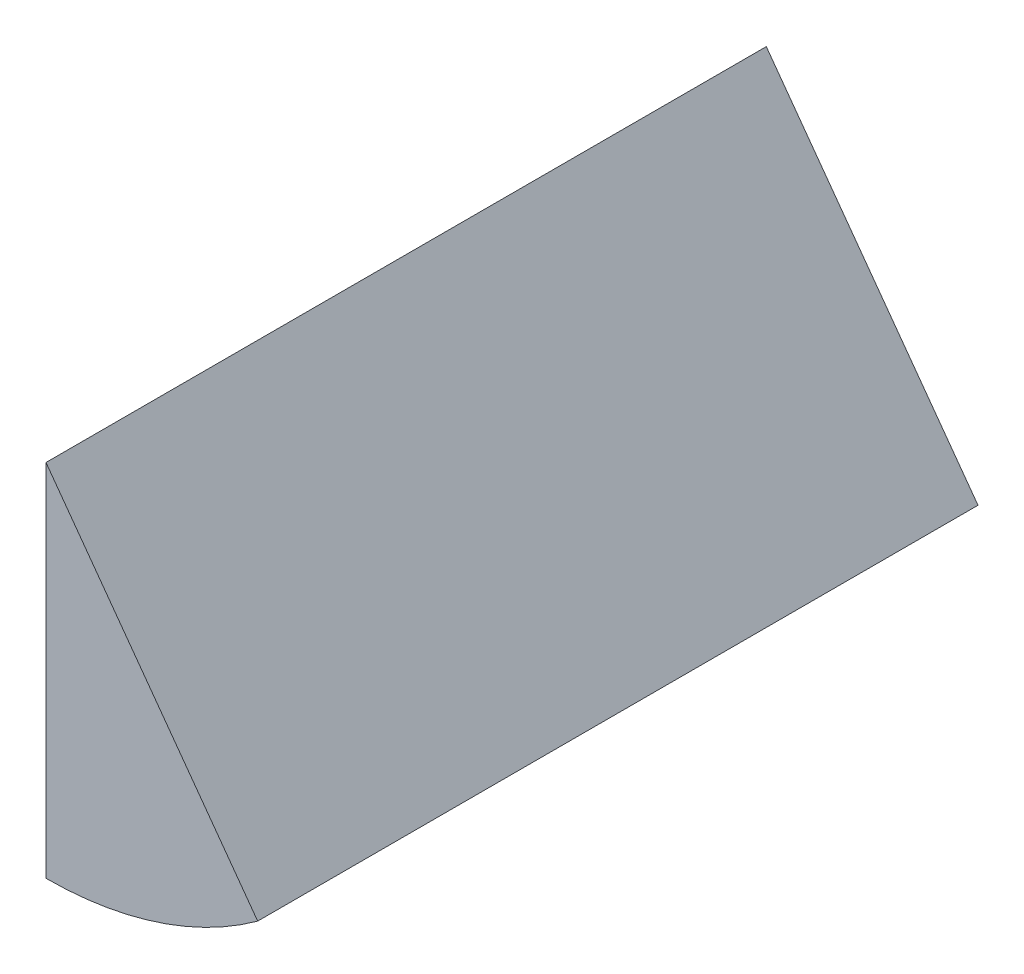
ISO-10303-21;
HEADER;
FILE_DESCRIPTION(('STEP AP214'),'2;1');
FILE_NAME('part.step','',(''),(''),'','','');
FILE_SCHEMA(('AUTOMOTIVE_DESIGN { 1 0 10303 214 1 1 1 1 }'));
ENDSEC;
DATA;
#1=APPLICATION_CONTEXT('core data for automotive mechanical design processes');
#2=APPLICATION_PROTOCOL_DEFINITION('international standard','automotive_design',2000,#1);
#3=PRODUCT_CONTEXT('',#1,'mechanical');
#4=PRODUCT('Part','Part','',(#3));
#5=PRODUCT_RELATED_PRODUCT_CATEGORY('part','',(#4));
#6=PRODUCT_DEFINITION_FORMATION('','',#4);
#7=PRODUCT_DEFINITION_CONTEXT('part definition',#1,'design');
#8=PRODUCT_DEFINITION('design','',#6,#7);
#9=PRODUCT_DEFINITION_SHAPE('','',#8);
#10=(LENGTH_UNIT() NAMED_UNIT(*) SI_UNIT(.MILLI.,.METRE.));
#11=(NAMED_UNIT(*) PLANE_ANGLE_UNIT() SI_UNIT($,.RADIAN.));
#12=(NAMED_UNIT(*) SI_UNIT($,.STERADIAN.) SOLID_ANGLE_UNIT());
#13=UNCERTAINTY_MEASURE_WITH_UNIT(LENGTH_MEASURE(1.E-05),#10,'distance_accuracy_value','');
#14=(GEOMETRIC_REPRESENTATION_CONTEXT(3) GLOBAL_UNCERTAINTY_ASSIGNED_CONTEXT((#13)) GLOBAL_UNIT_ASSIGNED_CONTEXT((#10,
#11,#12)) REPRESENTATION_CONTEXT('',''));
#15=CARTESIAN_POINT('',(0.,0.,0.));
#16=DIRECTION('',(0.,0.,1.));
#17=DIRECTION('',(1.,0.,0.));
#18=AXIS2_PLACEMENT_3D('',#15,#16,#17);
#19=CARTESIAN_POINT('',(0.,0.,50.));
#20=DIRECTION('',(-0.809016994374946,-0.587785252292475,0.));
#21=DIRECTION('',(0.587785252292475,-0.809016994374946,0.));
#22=AXIS2_PLACEMENT_3D('',#19,#20,#21);
#23=PLANE('',#22);
#24=DIRECTION('',(-0.587785252292475,0.809016994374946,0.));
#25=VECTOR('',#24,1.);
#26=CARTESIAN_POINT('',(0.,0.,0.));
#27=LINE('',#26,#25);
#28=CARTESIAN_POINT('',(14.6946313073119,-20.2254248593737,0.));
#29=VERTEX_POINT('',#28);
#30=CARTESIAN_POINT('',(0.,0.,0.));
#31=VERTEX_POINT('',#30);
#32=EDGE_CURVE('E80',#29,#31,#27,.T.);
#33=ORIENTED_EDGE('',*,*,#32,.T.);
#34=DIRECTION('',(0.,0.,-1.));
#35=VECTOR('',#34,1.);
#36=CARTESIAN_POINT('',(0.,0.,50.));
#37=LINE('',#36,#35);
#38=CARTESIAN_POINT('',(0.,0.,50.));
#39=VERTEX_POINT('',#38);
#40=EDGE_CURVE('E11',#39,#31,#37,.T.);
#41=ORIENTED_EDGE('',*,*,#40,.F.);
#42=DIRECTION('',(-0.587785252292475,0.809016994374946,0.));
#43=VECTOR('',#42,1.);
#44=CARTESIAN_POINT('',(0.,0.,50.));
#45=LINE('',#44,#43);
#46=CARTESIAN_POINT('',(14.6946313073119,-20.2254248593737,50.));
#47=VERTEX_POINT('',#46);
#48=EDGE_CURVE('E73',#47,#39,#45,.T.);
#49=ORIENTED_EDGE('',*,*,#48,.F.);
#50=DIRECTION('',(0.,0.,-1.));
#51=VECTOR('',#50,1.);
#52=CARTESIAN_POINT('',(14.6946313073119,-20.2254248593737,50.));
#53=LINE('',#52,#51);
#54=EDGE_CURVE('E81',#47,#29,#53,.T.);
#55=ORIENTED_EDGE('',*,*,#54,.T.);
#56=EDGE_LOOP('',(#33,#41,#49,#55));
#57=FACE_BOUND('',#56,.T.);
#58=ADVANCED_FACE('F33',(#57),#23,.F.);
#59=CARTESIAN_POINT('',(0.,0.,50.));
#60=DIRECTION('',(1.,0.,0.));
#61=DIRECTION('',(0.,0.,-1.));
#62=AXIS2_PLACEMENT_3D('',#59,#60,#61);
#63=PLANE('',#62);
#64=DIRECTION('',(0.,-1.,0.));
#65=VECTOR('',#64,1.);
#66=CARTESIAN_POINT('',(0.,0.,0.));
#67=LINE('',#66,#65);
#68=CARTESIAN_POINT('',(0.,-25.,0.));
#69=VERTEX_POINT('',#68);
#70=EDGE_CURVE('E61',#31,#69,#67,.T.);
#71=ORIENTED_EDGE('',*,*,#70,.T.);
#72=DIRECTION('',(0.,0.,-1.));
#73=VECTOR('',#72,1.);
#74=CARTESIAN_POINT('',(0.,-25.,50.));
#75=LINE('',#74,#73);
#76=CARTESIAN_POINT('',(0.,-25.,50.));
#77=VERTEX_POINT('',#76);
#78=EDGE_CURVE('E41',#77,#69,#75,.T.);
#79=ORIENTED_EDGE('',*,*,#78,.F.);
#80=DIRECTION('',(0.,-1.,0.));
#81=VECTOR('',#80,1.);
#82=CARTESIAN_POINT('',(0.,0.,50.));
#83=LINE('',#82,#81);
#84=EDGE_CURVE('E69',#39,#77,#83,.T.);
#85=ORIENTED_EDGE('',*,*,#84,.F.);
#86=ORIENTED_EDGE('',*,*,#40,.T.);
#87=EDGE_LOOP('',(#71,#79,#85,#86));
#88=FACE_BOUND('',#87,.T.);
#89=ADVANCED_FACE('F70',(#88),#63,.F.);
#90=CARTESIAN_POINT('',(0.,0.,50.));
#91=DIRECTION('',(0.,0.,-1.));
#92=DIRECTION('',(-1.,0.,0.));
#93=AXIS2_PLACEMENT_3D('',#90,#91,#92);
#94=CYLINDRICAL_SURFACE('',#93,25.);
#95=CARTESIAN_POINT('',(0.,0.,0.));
#96=DIRECTION('',(0.,0.,1.));
#97=DIRECTION('',(1.,0.,0.));
#98=AXIS2_PLACEMENT_3D('',#95,#96,#97);
#99=CIRCLE('',#98,25.);
#100=EDGE_CURVE('E66',#69,#29,#99,.T.);
#101=ORIENTED_EDGE('',*,*,#100,.T.);
#102=ORIENTED_EDGE('',*,*,#54,.F.);
#103=CARTESIAN_POINT('',(0.,0.,50.));
#104=DIRECTION('',(0.,0.,1.));
#105=DIRECTION('',(1.,0.,0.));
#106=AXIS2_PLACEMENT_3D('',#103,#104,#105);
#107=CIRCLE('',#106,25.);
#108=EDGE_CURVE('E49',#77,#47,#107,.T.);
#109=ORIENTED_EDGE('',*,*,#108,.F.);
#110=ORIENTED_EDGE('',*,*,#78,.T.);
#111=EDGE_LOOP('',(#101,#102,#109,#110));
#112=FACE_BOUND('',#111,.T.);
#113=ADVANCED_FACE('F92',(#112),#94,.T.);
#114=CARTESIAN_POINT('',(0.,0.,50.));
#115=DIRECTION('',(0.,0.,1.));
#116=DIRECTION('',(1.,0.,0.));
#117=AXIS2_PLACEMENT_3D('',#114,#115,#116);
#118=PLANE('',#117);
#119=ORIENTED_EDGE('',*,*,#48,.T.);
#120=ORIENTED_EDGE('',*,*,#84,.T.);
#121=ORIENTED_EDGE('',*,*,#108,.T.);
#122=EDGE_LOOP('',(#119,#120,#121));
#123=FACE_BOUND('',#122,.T.);
#124=ADVANCED_FACE('F76',(#123),#118,.T.);
#125=CARTESIAN_POINT('',(0.,0.,0.));
#126=DIRECTION('',(0.,0.,1.));
#127=DIRECTION('',(1.,0.,0.));
#128=AXIS2_PLACEMENT_3D('',#125,#126,#127);
#129=PLANE('',#128);
#130=CARTESIAN_POINT('',(5.93981261634996,-18.1490324605386,0.));
#131=DIRECTION('',(0.,0.,-1.));
#132=DIRECTION('',(-1.,0.,0.));
#133=AXIS2_PLACEMENT_3D('',#130,#131,#132);
#134=CIRCLE('',#133,5.03201379154318);
#135=CARTESIAN_POINT('',(0.90779882480678,-18.1490324605386,0.));
#136=VERTEX_POINT('',#135);
#137=EDGE_CURVE('E87',#136,#136,#134,.T.);
#138=ORIENTED_EDGE('',*,*,#137,.F.);
#139=EDGE_LOOP('',(#138));
#140=FACE_BOUND('',#139,.T.);
#141=ORIENTED_EDGE('',*,*,#32,.F.);
#142=ORIENTED_EDGE('',*,*,#100,.F.);
#143=ORIENTED_EDGE('',*,*,#70,.F.);
#144=EDGE_LOOP('',(#141,#142,#143));
#145=FACE_BOUND('',#144,.T.);
#146=ADVANCED_FACE('F93',(#140,#145),#129,.F.);
#147=CARTESIAN_POINT('',(5.93981261634996,-18.1490324605386,10.));
#148=DIRECTION('',(0.,0.,-1.));
#149=DIRECTION('',(-1.,0.,0.));
#150=AXIS2_PLACEMENT_3D('',#147,#148,#149);
#151=CYLINDRICAL_SURFACE('',#150,5.03201379154318);
#152=CARTESIAN_POINT('',(5.93981261634996,-18.1490324605386,10.));
#153=DIRECTION('',(0.,0.,-1.));
#154=DIRECTION('',(-1.,0.,0.));
#155=AXIS2_PLACEMENT_3D('',#152,#153,#154);
#156=CIRCLE('',#155,5.03201379154318);
#157=CARTESIAN_POINT('',(0.90779882480678,-18.1490324605386,10.));
#158=VERTEX_POINT('',#157);
#159=EDGE_CURVE('E83',#158,#158,#156,.T.);
#160=ORIENTED_EDGE('',*,*,#159,.F.);
#161=EDGE_LOOP('',(#160));
#162=FACE_BOUND('',#161,.T.);
#163=ORIENTED_EDGE('',*,*,#137,.T.);
#164=EDGE_LOOP('',(#163));
#165=FACE_BOUND('',#164,.T.);
#166=ADVANCED_FACE('F95',(#162,#165),#151,.F.);
#167=CARTESIAN_POINT('',(5.93981261634996,-18.1490324605386,10.));
#168=DIRECTION('',(0.,0.,-1.));
#169=DIRECTION('',(-1.,0.,0.));
#170=AXIS2_PLACEMENT_3D('',#167,#168,#169);
#171=PLANE('',#170);
#172=ORIENTED_EDGE('',*,*,#159,.T.);
#173=EDGE_LOOP('',(#172));
#174=FACE_BOUND('',#173,.T.);
#175=ADVANCED_FACE('F102',(#174),#171,.T.);
#176=CLOSED_SHELL('',(#58,#89,#113,#124,#146,#166,#175));
#177=MANIFOLD_SOLID_BREP('B2',#176);
#178=ADVANCED_BREP_SHAPE_REPRESENTATION('',(#18,#177),#14);
#179=SHAPE_DEFINITION_REPRESENTATION(#9,#178);
ENDSEC;
END-ISO-10303-21;
